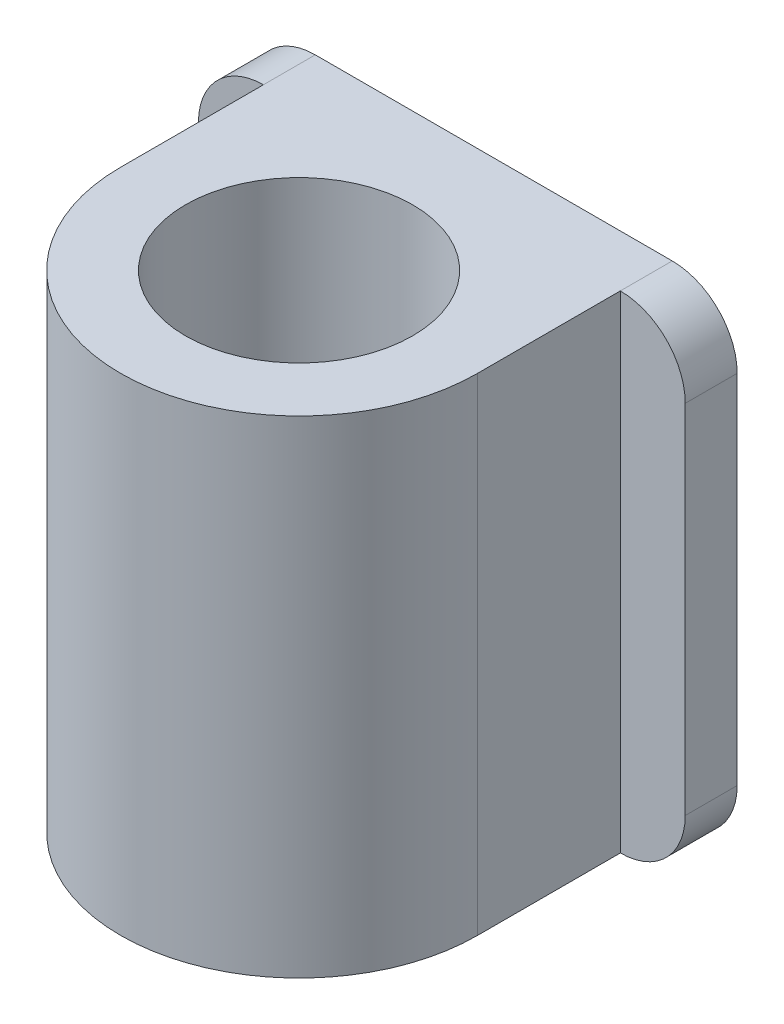
ISO-10303-21;
HEADER;
FILE_DESCRIPTION(('STEP AP214'),'2;1');
FILE_NAME('part.step','',(''),(''),'','','');
FILE_SCHEMA(('AUTOMOTIVE_DESIGN { 1 0 10303 214 1 1 1 1 }'));
ENDSEC;
DATA;
#1=APPLICATION_CONTEXT('core data for automotive mechanical design processes');
#2=APPLICATION_PROTOCOL_DEFINITION('international standard','automotive_design',2000,#1);
#3=PRODUCT_CONTEXT('',#1,'mechanical');
#4=PRODUCT('Part','Part','',(#3));
#5=PRODUCT_RELATED_PRODUCT_CATEGORY('part','',(#4));
#6=PRODUCT_DEFINITION_FORMATION('','',#4);
#7=PRODUCT_DEFINITION_CONTEXT('part definition',#1,'design');
#8=PRODUCT_DEFINITION('design','',#6,#7);
#9=PRODUCT_DEFINITION_SHAPE('','',#8);
#10=(LENGTH_UNIT() NAMED_UNIT(*) SI_UNIT(.MILLI.,.METRE.));
#11=(NAMED_UNIT(*) PLANE_ANGLE_UNIT() SI_UNIT($,.RADIAN.));
#12=(NAMED_UNIT(*) SI_UNIT($,.STERADIAN.) SOLID_ANGLE_UNIT());
#13=UNCERTAINTY_MEASURE_WITH_UNIT(LENGTH_MEASURE(1.E-05),#10,'distance_accuracy_value','');
#14=(GEOMETRIC_REPRESENTATION_CONTEXT(3) GLOBAL_UNCERTAINTY_ASSIGNED_CONTEXT((#13)) GLOBAL_UNIT_ASSIGNED_CONTEXT((#10,
#11,#12)) REPRESENTATION_CONTEXT('',''));
#15=CARTESIAN_POINT('',(0.,0.,0.));
#16=DIRECTION('',(0.,0.,1.));
#17=DIRECTION('',(1.,0.,0.));
#18=AXIS2_PLACEMENT_3D('',#15,#16,#17);
#19=CARTESIAN_POINT('',(0.,0.,8.));
#20=DIRECTION('',(0.,0.,-1.));
#21=DIRECTION('',(-1.,0.,0.));
#22=AXIS2_PLACEMENT_3D('',#19,#20,#21);
#23=PLANE('',#22);
#24=DIRECTION('',(0.,-1.,0.));
#25=VECTOR('',#24,1.);
#26=CARTESIAN_POINT('',(-27.5,37.5,8.));
#27=LINE('',#26,#25);
#28=CARTESIAN_POINT('',(-27.5,37.5,8.));
#29=VERTEX_POINT('',#28);
#30=CARTESIAN_POINT('',(-27.5,-37.5,8.));
#31=VERTEX_POINT('',#30);
#32=EDGE_CURVE('E154',#29,#31,#27,.T.);
#33=ORIENTED_EDGE('',*,*,#32,.F.);
#34=CARTESIAN_POINT('',(-27.5,27.5,8.));
#35=DIRECTION('',(0.,0.,-1.));
#36=DIRECTION('',(-1.,0.,0.));
#37=AXIS2_PLACEMENT_3D('',#34,#35,#36);
#38=CIRCLE('',#37,10.);
#39=CARTESIAN_POINT('',(-37.5,27.5,8.));
#40=VERTEX_POINT('',#39);
#41=EDGE_CURVE('E67',#29,#40,#38,.F.);
#42=ORIENTED_EDGE('',*,*,#41,.T.);
#43=DIRECTION('',(0.,-1.,0.));
#44=VECTOR('',#43,1.);
#45=CARTESIAN_POINT('',(-37.5,-37.5,8.));
#46=LINE('',#45,#44);
#47=CARTESIAN_POINT('',(-37.5,-27.5,8.));
#48=VERTEX_POINT('',#47);
#49=EDGE_CURVE('E161',#40,#48,#46,.T.);
#50=ORIENTED_EDGE('',*,*,#49,.T.);
#51=CARTESIAN_POINT('',(-27.5,-27.5,8.));
#52=DIRECTION('',(0.,0.,-1.));
#53=DIRECTION('',(-1.,0.,0.));
#54=AXIS2_PLACEMENT_3D('',#51,#52,#53);
#55=CIRCLE('',#54,10.);
#56=EDGE_CURVE('E192',#48,#31,#55,.F.);
#57=ORIENTED_EDGE('',*,*,#56,.T.);
#58=EDGE_LOOP('',(#33,#42,#50,#57));
#59=FACE_BOUND('',#58,.T.);
#60=ADVANCED_FACE('F45',(#59),#23,.F.);
#61=CARTESIAN_POINT('',(37.5,-37.5,8.));
#62=DIRECTION('',(-1.,0.,0.));
#63=DIRECTION('',(0.,0.,1.));
#64=AXIS2_PLACEMENT_3D('',#61,#62,#63);
#65=PLANE('',#64);
#66=DIRECTION('',(0.,1.,0.));
#67=VECTOR('',#66,1.);
#68=CARTESIAN_POINT('',(37.5,-37.5,8.));
#69=LINE('',#68,#67);
#70=CARTESIAN_POINT('',(37.5,-27.5,8.));
#71=VERTEX_POINT('',#70);
#72=CARTESIAN_POINT('',(37.5,27.5,8.));
#73=VERTEX_POINT('',#72);
#74=EDGE_CURVE('E158',#71,#73,#69,.T.);
#75=ORIENTED_EDGE('',*,*,#74,.F.);
#76=DIRECTION('',(0.,0.,-1.));
#77=VECTOR('',#76,1.);
#78=CARTESIAN_POINT('',(37.5,-27.5,8.));
#79=LINE('',#78,#77);
#80=CARTESIAN_POINT('',(37.5,-27.5,0.));
#81=VERTEX_POINT('',#80);
#82=EDGE_CURVE('E172',#71,#81,#79,.T.);
#83=ORIENTED_EDGE('',*,*,#82,.T.);
#84=DIRECTION('',(0.,1.,0.));
#85=VECTOR('',#84,1.);
#86=CARTESIAN_POINT('',(37.5,-37.5,0.));
#87=LINE('',#86,#85);
#88=CARTESIAN_POINT('',(37.5,27.5,0.));
#89=VERTEX_POINT('',#88);
#90=EDGE_CURVE('E149',#81,#89,#87,.T.);
#91=ORIENTED_EDGE('',*,*,#90,.T.);
#92=DIRECTION('',(0.,0.,-1.));
#93=VECTOR('',#92,1.);
#94=CARTESIAN_POINT('',(37.5,27.5,8.));
#95=LINE('',#94,#93);
#96=EDGE_CURVE('E163',#89,#73,#95,.F.);
#97=ORIENTED_EDGE('',*,*,#96,.T.);
#98=EDGE_LOOP('',(#75,#83,#91,#97));
#99=FACE_BOUND('',#98,.T.);
#100=ADVANCED_FACE('F238',(#99),#65,.F.);
#101=CARTESIAN_POINT('',(-37.5,37.5,8.));
#102=DIRECTION('',(0.,-1.,0.));
#103=DIRECTION('',(0.,0.,-1.));
#104=AXIS2_PLACEMENT_3D('',#101,#102,#103);
#105=PLANE('',#104);
#106=DIRECTION('',(0.,0.,-1.));
#107=VECTOR('',#106,1.);
#108=CARTESIAN_POINT('',(-27.5,37.5,8.));
#109=LINE('',#108,#107);
#110=CARTESIAN_POINT('',(-27.5,37.5,0.));
#111=VERTEX_POINT('',#110);
#112=EDGE_CURVE('E53',#111,#29,#109,.F.);
#113=ORIENTED_EDGE('',*,*,#112,.T.);
#114=DIRECTION('',(0.,0.,1.));
#115=VECTOR('',#114,1.);
#116=CARTESIAN_POINT('',(-27.5,37.5,8.));
#117=LINE('',#116,#115);
#118=CARTESIAN_POINT('',(-27.5,37.5,30.));
#119=VERTEX_POINT('',#118);
#120=EDGE_CURVE('E134',#29,#119,#117,.T.);
#121=ORIENTED_EDGE('',*,*,#120,.T.);
#122=CARTESIAN_POINT('',(0.,37.5,30.));
#123=DIRECTION('',(0.,1.,0.));
#124=DIRECTION('',(0.,0.,1.));
#125=AXIS2_PLACEMENT_3D('',#122,#123,#124);
#126=CIRCLE('',#125,27.5);
#127=CARTESIAN_POINT('',(27.5,37.5,30.));
#128=VERTEX_POINT('',#127);
#129=EDGE_CURVE('E135',#119,#128,#126,.T.);
#130=ORIENTED_EDGE('',*,*,#129,.T.);
#131=DIRECTION('',(0.,0.,-1.));
#132=VECTOR('',#131,1.);
#133=CARTESIAN_POINT('',(27.5,37.5,30.));
#134=LINE('',#133,#132);
#135=CARTESIAN_POINT('',(27.5,37.5,8.));
#136=VERTEX_POINT('',#135);
#137=EDGE_CURVE('E124',#128,#136,#134,.T.);
#138=ORIENTED_EDGE('',*,*,#137,.T.);
#139=DIRECTION('',(0.,0.,-1.));
#140=VECTOR('',#139,1.);
#141=CARTESIAN_POINT('',(27.5,37.5,8.));
#142=LINE('',#141,#140);
#143=CARTESIAN_POINT('',(27.5,37.5,0.));
#144=VERTEX_POINT('',#143);
#145=EDGE_CURVE('E11',#136,#144,#142,.T.);
#146=ORIENTED_EDGE('',*,*,#145,.T.);
#147=DIRECTION('',(-1.,0.,0.));
#148=VECTOR('',#147,1.);
#149=CARTESIAN_POINT('',(-37.5,37.5,0.));
#150=LINE('',#149,#148);
#151=EDGE_CURVE('E152',#144,#111,#150,.T.);
#152=ORIENTED_EDGE('',*,*,#151,.T.);
#153=EDGE_LOOP('',(#113,#121,#130,#138,#146,#152));
#154=FACE_BOUND('',#153,.T.);
#155=CARTESIAN_POINT('',(0.,37.5,30.));
#156=DIRECTION('',(0.,1.,0.));
#157=DIRECTION('',(0.,0.,1.));
#158=AXIS2_PLACEMENT_3D('',#155,#156,#157);
#159=CIRCLE('',#158,17.5);
#160=CARTESIAN_POINT('',(0.,37.5,47.5));
#161=VERTEX_POINT('',#160);
#162=EDGE_CURVE('E227',#161,#161,#159,.T.);
#163=ORIENTED_EDGE('',*,*,#162,.F.);
#164=EDGE_LOOP('',(#163));
#165=FACE_BOUND('',#164,.T.);
#166=ADVANCED_FACE('F139',(#154,#165),#105,.F.);
#167=CARTESIAN_POINT('',(-37.5,-37.5,8.));
#168=DIRECTION('',(1.,0.,0.));
#169=DIRECTION('',(0.,0.,-1.));
#170=AXIS2_PLACEMENT_3D('',#167,#168,#169);
#171=PLANE('',#170);
#172=DIRECTION('',(0.,-1.,0.));
#173=VECTOR('',#172,1.);
#174=CARTESIAN_POINT('',(-37.5,-37.5,0.));
#175=LINE('',#174,#173);
#176=CARTESIAN_POINT('',(-37.5,27.5,0.));
#177=VERTEX_POINT('',#176);
#178=CARTESIAN_POINT('',(-37.5,-27.5,0.));
#179=VERTEX_POINT('',#178);
#180=EDGE_CURVE('E167',#177,#179,#175,.T.);
#181=ORIENTED_EDGE('',*,*,#180,.T.);
#182=DIRECTION('',(0.,0.,-1.));
#183=VECTOR('',#182,1.);
#184=CARTESIAN_POINT('',(-37.5,-27.5,8.));
#185=LINE('',#184,#183);
#186=EDGE_CURVE('E60',#179,#48,#185,.F.);
#187=ORIENTED_EDGE('',*,*,#186,.T.);
#188=ORIENTED_EDGE('',*,*,#49,.F.);
#189=DIRECTION('',(0.,0.,-1.));
#190=VECTOR('',#189,1.);
#191=CARTESIAN_POINT('',(-37.5,27.5,8.));
#192=LINE('',#191,#190);
#193=EDGE_CURVE('E197',#40,#177,#192,.T.);
#194=ORIENTED_EDGE('',*,*,#193,.T.);
#195=EDGE_LOOP('',(#181,#187,#188,#194));
#196=FACE_BOUND('',#195,.T.);
#197=ADVANCED_FACE('F205',(#196),#171,.F.);
#198=CARTESIAN_POINT('',(-37.5,-37.5,8.));
#199=DIRECTION('',(0.,1.,0.));
#200=DIRECTION('',(0.,0.,1.));
#201=AXIS2_PLACEMENT_3D('',#198,#199,#200);
#202=PLANE('',#201);
#203=DIRECTION('',(1.,0.,0.));
#204=VECTOR('',#203,1.);
#205=CARTESIAN_POINT('',(-37.5,-37.5,0.));
#206=LINE('',#205,#204);
#207=CARTESIAN_POINT('',(-27.5,-37.5,0.));
#208=VERTEX_POINT('',#207);
#209=CARTESIAN_POINT('',(27.5,-37.5,0.));
#210=VERTEX_POINT('',#209);
#211=EDGE_CURVE('E162',#208,#210,#206,.T.);
#212=ORIENTED_EDGE('',*,*,#211,.T.);
#213=DIRECTION('',(0.,0.,-1.));
#214=VECTOR('',#213,1.);
#215=CARTESIAN_POINT('',(27.5,-37.5,8.));
#216=LINE('',#215,#214);
#217=CARTESIAN_POINT('',(27.5,-37.5,8.));
#218=VERTEX_POINT('',#217);
#219=EDGE_CURVE('E186',#210,#218,#216,.F.);
#220=ORIENTED_EDGE('',*,*,#219,.T.);
#221=DIRECTION('',(0.,0.,-1.));
#222=VECTOR('',#221,1.);
#223=CARTESIAN_POINT('',(27.5,-37.5,30.));
#224=LINE('',#223,#222);
#225=CARTESIAN_POINT('',(27.5,-37.5,30.));
#226=VERTEX_POINT('',#225);
#227=EDGE_CURVE('E220',#226,#218,#224,.T.);
#228=ORIENTED_EDGE('',*,*,#227,.F.);
#229=CARTESIAN_POINT('',(0.,-37.5,30.));
#230=DIRECTION('',(0.,1.,0.));
#231=DIRECTION('',(0.,0.,1.));
#232=AXIS2_PLACEMENT_3D('',#229,#230,#231);
#233=CIRCLE('',#232,27.5);
#234=CARTESIAN_POINT('',(-27.5,-37.5,30.));
#235=VERTEX_POINT('',#234);
#236=EDGE_CURVE('E148',#235,#226,#233,.T.);
#237=ORIENTED_EDGE('',*,*,#236,.F.);
#238=DIRECTION('',(0.,0.,1.));
#239=VECTOR('',#238,1.);
#240=CARTESIAN_POINT('',(-27.5,-37.5,8.));
#241=LINE('',#240,#239);
#242=EDGE_CURVE('E144',#31,#235,#241,.T.);
#243=ORIENTED_EDGE('',*,*,#242,.F.);
#244=DIRECTION('',(0.,0.,-1.));
#245=VECTOR('',#244,1.);
#246=CARTESIAN_POINT('',(-27.5,-37.5,8.));
#247=LINE('',#246,#245);
#248=EDGE_CURVE('E183',#31,#208,#247,.T.);
#249=ORIENTED_EDGE('',*,*,#248,.T.);
#250=EDGE_LOOP('',(#212,#220,#228,#237,#243,#249));
#251=FACE_BOUND('',#250,.T.);
#252=CARTESIAN_POINT('',(0.,-37.5,30.));
#253=DIRECTION('',(0.,1.,0.));
#254=DIRECTION('',(0.,0.,1.));
#255=AXIS2_PLACEMENT_3D('',#252,#253,#254);
#256=CIRCLE('',#255,17.5);
#257=CARTESIAN_POINT('',(0.,-37.5,47.5));
#258=VERTEX_POINT('',#257);
#259=EDGE_CURVE('E229',#258,#258,#256,.T.);
#260=ORIENTED_EDGE('',*,*,#259,.T.);
#261=EDGE_LOOP('',(#260));
#262=FACE_BOUND('',#261,.T.);
#263=ADVANCED_FACE('F216',(#251,#262),#202,.F.);
#264=CARTESIAN_POINT('',(27.5,27.5,8.));
#265=DIRECTION('',(0.,0.,-1.));
#266=DIRECTION('',(-1.,0.,0.));
#267=AXIS2_PLACEMENT_3D('',#264,#265,#266);
#268=CIRCLE('',#267,10.);
#269=EDGE_CURVE('E190',#73,#136,#268,.F.);
#270=ORIENTED_EDGE('',*,*,#269,.T.);
#271=DIRECTION('',(0.,-1.,0.));
#272=VECTOR('',#271,1.);
#273=CARTESIAN_POINT('',(27.5,37.5,8.));
#274=LINE('',#273,#272);
#275=EDGE_CURVE('E131',#136,#218,#274,.T.);
#276=ORIENTED_EDGE('',*,*,#275,.T.);
#277=CARTESIAN_POINT('',(27.5,-27.5,8.));
#278=DIRECTION('',(0.,0.,-1.));
#279=DIRECTION('',(-1.,0.,0.));
#280=AXIS2_PLACEMENT_3D('',#277,#278,#279);
#281=CIRCLE('',#280,10.);
#282=EDGE_CURVE('E195',#218,#71,#281,.F.);
#283=ORIENTED_EDGE('',*,*,#282,.T.);
#284=ORIENTED_EDGE('',*,*,#74,.T.);
#285=EDGE_LOOP('',(#270,#276,#283,#284));
#286=FACE_BOUND('',#285,.T.);
#287=ADVANCED_FACE('F249',(#286),#23,.F.);
#288=CARTESIAN_POINT('',(0.,0.,0.));
#289=DIRECTION('',(0.,0.,-1.));
#290=DIRECTION('',(-1.,0.,0.));
#291=AXIS2_PLACEMENT_3D('',#288,#289,#290);
#292=PLANE('',#291);
#293=ORIENTED_EDGE('',*,*,#90,.F.);
#294=CARTESIAN_POINT('',(27.5,-27.5,0.));
#295=DIRECTION('',(0.,0.,-1.));
#296=DIRECTION('',(-1.,0.,0.));
#297=AXIS2_PLACEMENT_3D('',#294,#295,#296);
#298=CIRCLE('',#297,10.);
#299=EDGE_CURVE('E181',#81,#210,#298,.T.);
#300=ORIENTED_EDGE('',*,*,#299,.T.);
#301=ORIENTED_EDGE('',*,*,#211,.F.);
#302=CARTESIAN_POINT('',(-27.5,-27.5,0.));
#303=DIRECTION('',(0.,0.,-1.));
#304=DIRECTION('',(-1.,0.,0.));
#305=AXIS2_PLACEMENT_3D('',#302,#303,#304);
#306=CIRCLE('',#305,10.);
#307=EDGE_CURVE('E179',#208,#179,#306,.T.);
#308=ORIENTED_EDGE('',*,*,#307,.T.);
#309=ORIENTED_EDGE('',*,*,#180,.F.);
#310=CARTESIAN_POINT('',(-27.5,27.5,0.));
#311=DIRECTION('',(0.,0.,-1.));
#312=DIRECTION('',(-1.,0.,0.));
#313=AXIS2_PLACEMENT_3D('',#310,#311,#312);
#314=CIRCLE('',#313,10.);
#315=EDGE_CURVE('E175',#177,#111,#314,.T.);
#316=ORIENTED_EDGE('',*,*,#315,.T.);
#317=ORIENTED_EDGE('',*,*,#151,.F.);
#318=CARTESIAN_POINT('',(27.5,27.5,0.));
#319=DIRECTION('',(0.,0.,-1.));
#320=DIRECTION('',(-1.,0.,0.));
#321=AXIS2_PLACEMENT_3D('',#318,#319,#320);
#322=CIRCLE('',#321,10.);
#323=EDGE_CURVE('E177',#144,#89,#322,.T.);
#324=ORIENTED_EDGE('',*,*,#323,.T.);
#325=EDGE_LOOP('',(#293,#300,#301,#308,#309,#316,#317,#324));
#326=FACE_BOUND('',#325,.T.);
#327=ADVANCED_FACE('F208',(#326),#292,.T.);
#328=CARTESIAN_POINT('',(27.5,-27.5,8.));
#329=DIRECTION('',(0.,0.,-1.));
#330=DIRECTION('',(-1.,0.,0.));
#331=AXIS2_PLACEMENT_3D('',#328,#329,#330);
#332=CYLINDRICAL_SURFACE('',#331,10.);
#333=ORIENTED_EDGE('',*,*,#282,.F.);
#334=ORIENTED_EDGE('',*,*,#219,.F.);
#335=ORIENTED_EDGE('',*,*,#299,.F.);
#336=ORIENTED_EDGE('',*,*,#82,.F.);
#337=EDGE_LOOP('',(#333,#334,#335,#336));
#338=FACE_BOUND('',#337,.T.);
#339=ADVANCED_FACE('F260',(#338),#332,.T.);
#340=CARTESIAN_POINT('',(-27.5,-27.5,8.));
#341=DIRECTION('',(0.,0.,-1.));
#342=DIRECTION('',(-1.,0.,0.));
#343=AXIS2_PLACEMENT_3D('',#340,#341,#342);
#344=CYLINDRICAL_SURFACE('',#343,10.);
#345=ORIENTED_EDGE('',*,*,#56,.F.);
#346=ORIENTED_EDGE('',*,*,#186,.F.);
#347=ORIENTED_EDGE('',*,*,#307,.F.);
#348=ORIENTED_EDGE('',*,*,#248,.F.);
#349=EDGE_LOOP('',(#345,#346,#347,#348));
#350=FACE_BOUND('',#349,.T.);
#351=ADVANCED_FACE('F213',(#350),#344,.T.);
#352=CARTESIAN_POINT('',(27.5,27.5,8.));
#353=DIRECTION('',(0.,0.,-1.));
#354=DIRECTION('',(-1.,0.,0.));
#355=AXIS2_PLACEMENT_3D('',#352,#353,#354);
#356=CYLINDRICAL_SURFACE('',#355,10.);
#357=ORIENTED_EDGE('',*,*,#269,.F.);
#358=ORIENTED_EDGE('',*,*,#96,.F.);
#359=ORIENTED_EDGE('',*,*,#323,.F.);
#360=ORIENTED_EDGE('',*,*,#145,.F.);
#361=EDGE_LOOP('',(#357,#358,#359,#360));
#362=FACE_BOUND('',#361,.T.);
#363=ADVANCED_FACE('F267',(#362),#356,.T.);
#364=CARTESIAN_POINT('',(-27.5,27.5,8.));
#365=DIRECTION('',(0.,0.,-1.));
#366=DIRECTION('',(-1.,0.,0.));
#367=AXIS2_PLACEMENT_3D('',#364,#365,#366);
#368=CYLINDRICAL_SURFACE('',#367,10.);
#369=ORIENTED_EDGE('',*,*,#41,.F.);
#370=ORIENTED_EDGE('',*,*,#112,.F.);
#371=ORIENTED_EDGE('',*,*,#315,.F.);
#372=ORIENTED_EDGE('',*,*,#193,.F.);
#373=EDGE_LOOP('',(#369,#370,#371,#372));
#374=FACE_BOUND('',#373,.T.);
#375=ADVANCED_FACE('F47',(#374),#368,.T.);
#376=CARTESIAN_POINT('',(0.,37.5,30.));
#377=DIRECTION('',(0.,-1.,0.));
#378=DIRECTION('',(0.,0.,-1.));
#379=AXIS2_PLACEMENT_3D('',#376,#377,#378);
#380=CYLINDRICAL_SURFACE('',#379,27.5);
#381=ORIENTED_EDGE('',*,*,#236,.T.);
#382=DIRECTION('',(0.,-1.,0.));
#383=VECTOR('',#382,1.);
#384=CARTESIAN_POINT('',(27.5,37.5,30.));
#385=LINE('',#384,#383);
#386=EDGE_CURVE('E128',#128,#226,#385,.T.);
#387=ORIENTED_EDGE('',*,*,#386,.F.);
#388=ORIENTED_EDGE('',*,*,#129,.F.);
#389=DIRECTION('',(0.,-1.,0.));
#390=VECTOR('',#389,1.);
#391=CARTESIAN_POINT('',(-27.5,37.5,30.));
#392=LINE('',#391,#390);
#393=EDGE_CURVE('E222',#119,#235,#392,.T.);
#394=ORIENTED_EDGE('',*,*,#393,.T.);
#395=EDGE_LOOP('',(#381,#387,#388,#394));
#396=FACE_BOUND('',#395,.T.);
#397=ADVANCED_FACE('F146',(#396),#380,.T.);
#398=CARTESIAN_POINT('',(27.5,37.5,30.));
#399=DIRECTION('',(-1.,0.,0.));
#400=DIRECTION('',(0.,0.,1.));
#401=AXIS2_PLACEMENT_3D('',#398,#399,#400);
#402=PLANE('',#401);
#403=ORIENTED_EDGE('',*,*,#227,.T.);
#404=ORIENTED_EDGE('',*,*,#275,.F.);
#405=ORIENTED_EDGE('',*,*,#137,.F.);
#406=ORIENTED_EDGE('',*,*,#386,.T.);
#407=EDGE_LOOP('',(#403,#404,#405,#406));
#408=FACE_BOUND('',#407,.T.);
#409=ADVANCED_FACE('F126',(#408),#402,.F.);
#410=CARTESIAN_POINT('',(-27.5,37.5,8.));
#411=DIRECTION('',(1.,0.,0.));
#412=DIRECTION('',(0.,0.,-1.));
#413=AXIS2_PLACEMENT_3D('',#410,#411,#412);
#414=PLANE('',#413);
#415=ORIENTED_EDGE('',*,*,#242,.T.);
#416=ORIENTED_EDGE('',*,*,#393,.F.);
#417=ORIENTED_EDGE('',*,*,#120,.F.);
#418=ORIENTED_EDGE('',*,*,#32,.T.);
#419=EDGE_LOOP('',(#415,#416,#417,#418));
#420=FACE_BOUND('',#419,.T.);
#421=ADVANCED_FACE('F287',(#420),#414,.F.);
#422=CARTESIAN_POINT('',(0.,37.5,30.));
#423=DIRECTION('',(0.,-1.,0.));
#424=DIRECTION('',(0.,0.,-1.));
#425=AXIS2_PLACEMENT_3D('',#422,#423,#424);
#426=CYLINDRICAL_SURFACE('',#425,17.5);
#427=ORIENTED_EDGE('',*,*,#162,.T.);
#428=EDGE_LOOP('',(#427));
#429=FACE_BOUND('',#428,.T.);
#430=ORIENTED_EDGE('',*,*,#259,.F.);
#431=EDGE_LOOP('',(#430));
#432=FACE_BOUND('',#431,.T.);
#433=ADVANCED_FACE('F235',(#429,#432),#426,.F.);
#434=CLOSED_SHELL('',(#60,#100,#166,#197,#263,#287,#327,#339,#351,#363,#375,#397,#409,#421,#433));
#435=MANIFOLD_SOLID_BREP('B2',#434);
#436=ADVANCED_BREP_SHAPE_REPRESENTATION('',(#18,#435),#14);
#437=SHAPE_DEFINITION_REPRESENTATION(#9,#436);
ENDSEC;
END-ISO-10303-21;
